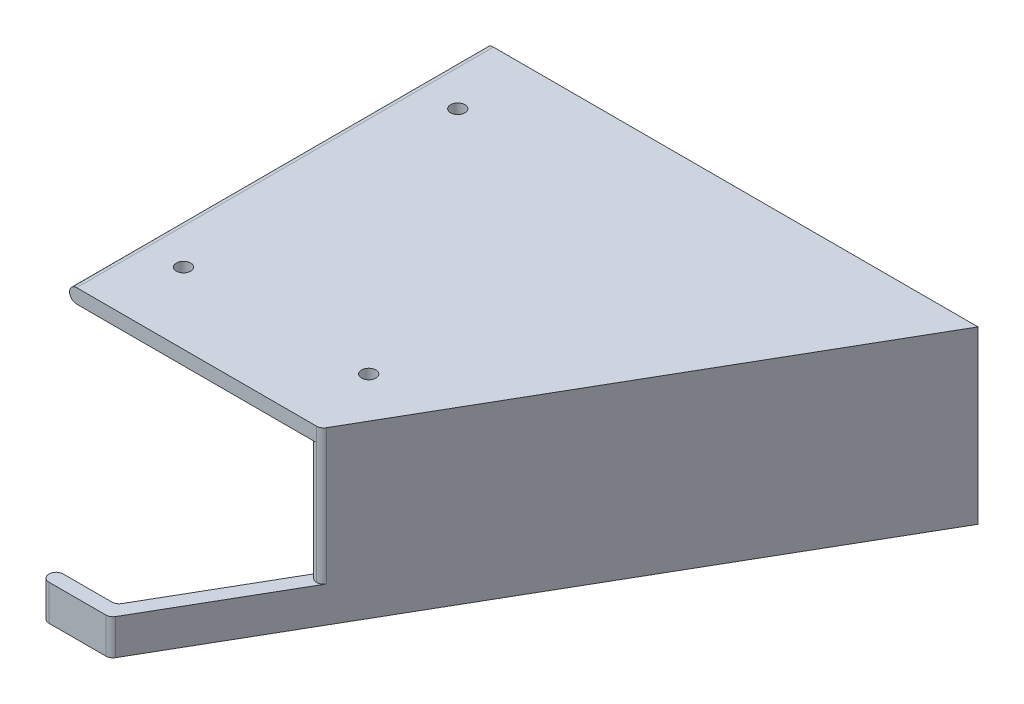
ISO-10303-21;
HEADER;
FILE_DESCRIPTION(('STEP AP214'),'2;1');
FILE_NAME('part.step','',(''),(''),'','','');
FILE_SCHEMA(('AUTOMOTIVE_DESIGN { 1 0 10303 214 1 1 1 1 }'));
ENDSEC;
DATA;
#1=APPLICATION_CONTEXT('core data for automotive mechanical design processes');
#2=APPLICATION_PROTOCOL_DEFINITION('international standard','automotive_design',2000,#1);
#3=PRODUCT_CONTEXT('',#1,'mechanical');
#4=PRODUCT('Part','Part','',(#3));
#5=PRODUCT_RELATED_PRODUCT_CATEGORY('part','',(#4));
#6=PRODUCT_DEFINITION_FORMATION('','',#4);
#7=PRODUCT_DEFINITION_CONTEXT('part definition',#1,'design');
#8=PRODUCT_DEFINITION('design','',#6,#7);
#9=PRODUCT_DEFINITION_SHAPE('','',#8);
#10=(LENGTH_UNIT() NAMED_UNIT(*) SI_UNIT(.MILLI.,.METRE.));
#11=(NAMED_UNIT(*) PLANE_ANGLE_UNIT() SI_UNIT($,.RADIAN.));
#12=(NAMED_UNIT(*) SI_UNIT($,.STERADIAN.) SOLID_ANGLE_UNIT());
#13=UNCERTAINTY_MEASURE_WITH_UNIT(LENGTH_MEASURE(1.E-05),#10,'distance_accuracy_value','');
#14=(GEOMETRIC_REPRESENTATION_CONTEXT(3) GLOBAL_UNCERTAINTY_ASSIGNED_CONTEXT((#13)) GLOBAL_UNIT_ASSIGNED_CONTEXT((#10,
#11,#12)) REPRESENTATION_CONTEXT('',''));
#15=CARTESIAN_POINT('',(0.,0.,0.));
#16=DIRECTION('',(0.,0.,1.));
#17=DIRECTION('',(1.,0.,0.));
#18=AXIS2_PLACEMENT_3D('',#15,#16,#17);
#19=CARTESIAN_POINT('',(49.2446325074975,-12.,73.4314018343474));
#20=DIRECTION('',(-0.866025403784442,0.,-0.499999999999994));
#21=DIRECTION('',(0.499999999999994,0.,-0.866025403784442));
#22=AXIS2_PLACEMENT_3D('',#19,#20,#21);
#23=PLANE('',#22);
#24=DIRECTION('',(-0.5,0.,0.866025403784439));
#25=VECTOR('',#24,1.);
#26=CARTESIAN_POINT('',(127.72466394788,10.,-62.5000000000001));
#27=LINE('',#26,#25);
#28=CARTESIAN_POINT('',(127.72466394788,10.,-62.5000000000001));
#29=VERTEX_POINT('',#28);
#30=CARTESIAN_POINT('',(94.8156986040718,10.,-5.50000000000008));
#31=VERTEX_POINT('',#30);
#32=EDGE_CURVE('E155',#29,#31,#27,.T.);
#33=ORIENTED_EDGE('',*,*,#32,.F.);
#34=DIRECTION('',(0.,1.,0.));
#35=VECTOR('',#34,1.);
#36=CARTESIAN_POINT('',(127.72466394788,-12.,-62.5000000000001));
#37=LINE('',#36,#35);
#38=CARTESIAN_POINT('',(127.72466394788,-12.,-62.5000000000001));
#39=VERTEX_POINT('',#38);
#40=EDGE_CURVE('E165',#39,#29,#37,.T.);
#41=ORIENTED_EDGE('',*,*,#40,.F.);
#42=DIRECTION('',(0.499999999999994,0.,-0.866025403784442));
#43=VECTOR('',#42,1.);
#44=CARTESIAN_POINT('',(49.2446325074975,-12.,73.4314018343474));
#45=LINE('',#44,#43);
#46=CARTESIAN_POINT('',(84.5677313259561,-12.,12.25));
#47=VERTEX_POINT('',#46);
#48=EDGE_CURVE('E174',#47,#39,#45,.T.);
#49=ORIENTED_EDGE('',*,*,#48,.F.);
#50=DIRECTION('',(0.,1.,0.));
#51=VECTOR('',#50,1.);
#52=CARTESIAN_POINT('',(84.5677313259561,-12.,12.2499999999999));
#53=LINE('',#52,#51);
#54=CARTESIAN_POINT('',(84.5677313259561,-7.,12.25));
#55=VERTEX_POINT('',#54);
#56=EDGE_CURVE('E241',#55,#47,#53,.F.);
#57=ORIENTED_EDGE('',*,*,#56,.F.);
#58=DIRECTION('',(0.499999999999994,0.,-0.866025403784442));
#59=VECTOR('',#58,1.);
#60=CARTESIAN_POINT('',(49.2446325074975,-7.,73.4314018343474));
#61=LINE('',#60,#59);
#62=CARTESIAN_POINT('',(94.8156986040718,-7.,-5.50000000000007));
#63=VERTEX_POINT('',#62);
#64=EDGE_CURVE('E198',#55,#63,#61,.T.);
#65=ORIENTED_EDGE('',*,*,#64,.T.);
#66=DIRECTION('',(0.,-1.,0.));
#67=VECTOR('',#66,1.);
#68=CARTESIAN_POINT('',(94.8156986040718,-12.,-5.50000000000007));
#69=LINE('',#68,#67);
#70=EDGE_CURVE('E178',#31,#63,#69,.T.);
#71=ORIENTED_EDGE('',*,*,#70,.F.);
#72=EDGE_LOOP('',(#33,#41,#49,#57,#65,#71));
#73=FACE_BOUND('',#72,.T.);
#74=ADVANCED_FACE('F45',(#73),#23,.T.);
#75=CARTESIAN_POINT('',(50.9766833150663,-12.,74.4314018343474));
#76=DIRECTION('',(-0.866025403784442,0.,-0.499999999999995));
#77=DIRECTION('',(0.499999999999995,0.,-0.866025403784442));
#78=AXIS2_PLACEMENT_3D('',#75,#76,#77);
#79=PLANE('',#78);
#80=DIRECTION('',(0.499999999999995,0.,-0.866025403784442));
#81=VECTOR('',#80,1.);
#82=CARTESIAN_POINT('',(50.9766833150663,-7.,74.4314018343474));
#83=LINE('',#82,#81);
#84=CARTESIAN_POINT('',(85.7224318643353,-7.,14.2499999999999));
#85=VERTEX_POINT('',#84);
#86=CARTESIAN_POINT('',(96.5477494116406,-7.,-4.50000000000009));
#87=VERTEX_POINT('',#86);
#88=EDGE_CURVE('E201',#85,#87,#83,.T.);
#89=ORIENTED_EDGE('',*,*,#88,.F.);
#90=DIRECTION('',(0.,1.,0.));
#91=VECTOR('',#90,1.);
#92=CARTESIAN_POINT('',(85.7224318643353,-12.,14.2499999999999));
#93=LINE('',#92,#91);
#94=CARTESIAN_POINT('',(85.7224318643353,-12.,14.2499999999999));
#95=VERTEX_POINT('',#94);
#96=EDGE_CURVE('E208',#95,#85,#93,.T.);
#97=ORIENTED_EDGE('',*,*,#96,.F.);
#98=DIRECTION('',(0.499999999999995,0.,-0.866025403784442));
#99=VECTOR('',#98,1.);
#100=CARTESIAN_POINT('',(50.9766833150663,-12.,74.4314018343474));
#101=LINE('',#100,#99);
#102=CARTESIAN_POINT('',(130.034065024638,-12.,-62.5000000000001));
#103=VERTEX_POINT('',#102);
#104=EDGE_CURVE('E195',#95,#103,#101,.T.);
#105=ORIENTED_EDGE('',*,*,#104,.T.);
#106=DIRECTION('',(0.,1.,0.));
#107=VECTOR('',#106,1.);
#108=CARTESIAN_POINT('',(130.034065024638,-12.,-62.5000000000001));
#109=LINE('',#108,#107);
#110=CARTESIAN_POINT('',(130.034065024638,12.,-62.5000000000001));
#111=VERTEX_POINT('',#110);
#112=EDGE_CURVE('E173',#103,#111,#109,.T.);
#113=ORIENTED_EDGE('',*,*,#112,.T.);
#114=DIRECTION('',(-0.499999999999995,0.,0.866025403784442));
#115=VECTOR('',#114,1.);
#116=CARTESIAN_POINT('',(50.9766833150663,12.,74.4314018343474));
#117=LINE('',#116,#115);
#118=CARTESIAN_POINT('',(96.5477494116406,12.,-4.50000000000008));
#119=VERTEX_POINT('',#118);
#120=EDGE_CURVE('E191',#111,#119,#117,.T.);
#121=ORIENTED_EDGE('',*,*,#120,.T.);
#122=DIRECTION('',(0.,-1.,0.));
#123=VECTOR('',#122,1.);
#124=CARTESIAN_POINT('',(96.5477494116406,12.,-4.50000000000009));
#125=LINE('',#124,#123);
#126=EDGE_CURVE('E267',#87,#119,#125,.F.);
#127=ORIENTED_EDGE('',*,*,#126,.F.);
#128=EDGE_LOOP('',(#89,#97,#105,#113,#121,#127));
#129=FACE_BOUND('',#128,.T.);
#130=ADVANCED_FACE('F313',(#129),#79,.F.);
#131=CARTESIAN_POINT('',(0.,-12.,-62.5));
#132=DIRECTION('',(0.,0.,1.));
#133=DIRECTION('',(-1.,0.,0.));
#134=AXIS2_PLACEMENT_3D('',#131,#132,#133);
#135=PLANE('',#134);
#136=CARTESIAN_POINT('',(62.,11.,-62.5000000000001));
#137=DIRECTION('',(0.,0.,-1.));
#138=DIRECTION('',(-1.,0.,0.));
#139=AXIS2_PLACEMENT_3D('',#136,#137,#138);
#140=CIRCLE('',#139,1.);
#141=CARTESIAN_POINT('',(62.,12.,-62.5000000000001));
#142=VERTEX_POINT('',#141);
#143=CARTESIAN_POINT('',(61.,11.,-62.5000000000001));
#144=VERTEX_POINT('',#143);
#145=EDGE_CURVE('E249',#142,#144,#140,.F.);
#146=ORIENTED_EDGE('',*,*,#145,.F.);
#147=DIRECTION('',(1.,0.,0.));
#148=VECTOR('',#147,1.);
#149=CARTESIAN_POINT('',(0.,12.,-62.5));
#150=LINE('',#149,#148);
#151=EDGE_CURVE('E189',#142,#111,#150,.T.);
#152=ORIENTED_EDGE('',*,*,#151,.T.);
#153=ORIENTED_EDGE('',*,*,#112,.F.);
#154=DIRECTION('',(-1.,0.,0.));
#155=VECTOR('',#154,1.);
#156=CARTESIAN_POINT('',(0.,-12.,-62.5));
#157=LINE('',#156,#155);
#158=EDGE_CURVE('E169',#103,#39,#157,.T.);
#159=ORIENTED_EDGE('',*,*,#158,.T.);
#160=ORIENTED_EDGE('',*,*,#40,.T.);
#161=DIRECTION('',(1.,0.,0.));
#162=VECTOR('',#161,1.);
#163=CARTESIAN_POINT('',(61.,10.,-62.5000000000001));
#164=LINE('',#163,#162);
#165=CARTESIAN_POINT('',(62.,10.,-62.5000000000001));
#166=VERTEX_POINT('',#165);
#167=EDGE_CURVE('E150',#166,#29,#164,.T.);
#168=ORIENTED_EDGE('',*,*,#167,.F.);
#169=CARTESIAN_POINT('',(62.,11.,-62.5000000000001));
#170=DIRECTION('',(0.,0.,-1.));
#171=DIRECTION('',(-1.,0.,0.));
#172=AXIS2_PLACEMENT_3D('',#169,#170,#171);
#173=CIRCLE('',#172,1.);
#174=EDGE_CURVE('E252',#144,#166,#173,.F.);
#175=ORIENTED_EDGE('',*,*,#174,.F.);
#176=EDGE_LOOP('',(#146,#152,#153,#159,#160,#168,#175));
#177=FACE_BOUND('',#176,.T.);
#178=ADVANCED_FACE('F167',(#177),#135,.F.);
#179=CARTESIAN_POINT('',(0.,-7.,45.));
#180=DIRECTION('',(0.,-1.,0.));
#181=DIRECTION('',(0.,0.,1.));
#182=AXIS2_PLACEMENT_3D('',#179,#180,#181);
#183=PLANE('',#182);
#184=ORIENTED_EDGE('',*,*,#64,.F.);
#185=CARTESIAN_POINT('',(83.7017059221717,-7.,11.75));
#186=DIRECTION('',(0.,1.,0.));
#187=DIRECTION('',(0.,0.,1.));
#188=AXIS2_PLACEMENT_3D('',#185,#186,#187);
#189=CIRCLE('',#188,1.);
#190=CARTESIAN_POINT('',(83.7017059221717,-7.,12.75));
#191=VERTEX_POINT('',#190);
#192=EDGE_CURVE('E244',#191,#55,#189,.T.);
#193=ORIENTED_EDGE('',*,*,#192,.F.);
#194=DIRECTION('',(-1.,0.,0.));
#195=VECTOR('',#194,1.);
#196=CARTESIAN_POINT('',(84.8564064605509,-7.,12.75));
#197=LINE('',#196,#195);
#198=CARTESIAN_POINT('',(76.8564064605509,-7.,12.75));
#199=VERTEX_POINT('',#198);
#200=EDGE_CURVE('E216',#191,#199,#197,.T.);
#201=ORIENTED_EDGE('',*,*,#200,.T.);
#202=CARTESIAN_POINT('',(76.8564064605509,-7.,13.75));
#203=DIRECTION('',(0.,-1.,0.));
#204=DIRECTION('',(0.,0.,-1.));
#205=AXIS2_PLACEMENT_3D('',#202,#203,#204);
#206=CIRCLE('',#205,0.999999999999985);
#207=CARTESIAN_POINT('',(76.8564064605509,-7.,14.7499999999999));
#208=VERTEX_POINT('',#207);
#209=EDGE_CURVE('E231',#208,#199,#206,.T.);
#210=ORIENTED_EDGE('',*,*,#209,.F.);
#211=DIRECTION('',(-1.,0.,0.));
#212=VECTOR('',#211,1.);
#213=CARTESIAN_POINT('',(84.8564064605509,-7.,14.7499999999999));
#214=LINE('',#213,#212);
#215=CARTESIAN_POINT('',(84.8564064605509,-7.,14.7499999999999));
#216=VERTEX_POINT('',#215);
#217=EDGE_CURVE('E228',#216,#208,#214,.T.);
#218=ORIENTED_EDGE('',*,*,#217,.F.);
#219=CARTESIAN_POINT('',(84.8564064605509,-7.,13.75));
#220=DIRECTION('',(0.,-1.,0.));
#221=DIRECTION('',(0.,0.,-1.));
#222=AXIS2_PLACEMENT_3D('',#219,#220,#221);
#223=CIRCLE('',#222,0.999999999999987);
#224=EDGE_CURVE('E194',#85,#216,#223,.T.);
#225=ORIENTED_EDGE('',*,*,#224,.F.);
#226=ORIENTED_EDGE('',*,*,#88,.T.);
#227=CARTESIAN_POINT('',(95.6817240078562,-7.,-5.00000000000009));
#228=DIRECTION('',(0.,1.,0.));
#229=DIRECTION('',(0.,0.,1.));
#230=AXIS2_PLACEMENT_3D('',#227,#228,#229);
#231=CIRCLE('',#230,1.);
#232=CARTESIAN_POINT('',(95.6817240078562,-7.,-4.00000000000009));
#233=VERTEX_POINT('',#232);
#234=EDGE_CURVE('E271',#233,#87,#231,.T.);
#235=ORIENTED_EDGE('',*,*,#234,.F.);
#236=CARTESIAN_POINT('',(95.6817240078562,-7.,-5.00000000000009));
#237=DIRECTION('',(0.,1.,0.));
#238=DIRECTION('',(0.,0.,1.));
#239=AXIS2_PLACEMENT_3D('',#236,#237,#238);
#240=CIRCLE('',#239,1.);
#241=EDGE_CURVE('E54',#63,#233,#240,.T.);
#242=ORIENTED_EDGE('',*,*,#241,.F.);
#243=EDGE_LOOP('',(#184,#193,#201,#210,#218,#225,#226,#235,#242));
#244=FACE_BOUND('',#243,.T.);
#245=ADVANCED_FACE('F324',(#244),#183,.F.);
#246=CARTESIAN_POINT('',(0.,-12.,45.));
#247=DIRECTION('',(0.,-1.,0.));
#248=DIRECTION('',(0.,0.,1.));
#249=AXIS2_PLACEMENT_3D('',#246,#247,#248);
#250=PLANE('',#249);
#251=ORIENTED_EDGE('',*,*,#48,.T.);
#252=ORIENTED_EDGE('',*,*,#158,.F.);
#253=ORIENTED_EDGE('',*,*,#104,.F.);
#254=CARTESIAN_POINT('',(84.8564064605509,-12.,13.75));
#255=DIRECTION('',(0.,-1.,0.));
#256=DIRECTION('',(0.,0.,-1.));
#257=AXIS2_PLACEMENT_3D('',#254,#255,#256);
#258=CIRCLE('',#257,0.999999999999987);
#259=CARTESIAN_POINT('',(84.8564064605509,-12.,14.7499999999999));
#260=VERTEX_POINT('',#259);
#261=EDGE_CURVE('E212',#95,#260,#258,.T.);
#262=ORIENTED_EDGE('',*,*,#261,.T.);
#263=DIRECTION('',(-1.,0.,0.));
#264=VECTOR('',#263,1.);
#265=CARTESIAN_POINT('',(84.8564064605509,-12.,14.7499999999999));
#266=LINE('',#265,#264);
#267=CARTESIAN_POINT('',(76.8564064605509,-12.,14.7499999999999));
#268=VERTEX_POINT('',#267);
#269=EDGE_CURVE('E215',#260,#268,#266,.T.);
#270=ORIENTED_EDGE('',*,*,#269,.T.);
#271=CARTESIAN_POINT('',(76.8564064605509,-12.,13.75));
#272=DIRECTION('',(0.,-1.,0.));
#273=DIRECTION('',(0.,0.,-1.));
#274=AXIS2_PLACEMENT_3D('',#271,#272,#273);
#275=CIRCLE('',#274,0.999999999999985);
#276=CARTESIAN_POINT('',(76.8564064605509,-12.,12.75));
#277=VERTEX_POINT('',#276);
#278=EDGE_CURVE('E219',#268,#277,#275,.T.);
#279=ORIENTED_EDGE('',*,*,#278,.T.);
#280=DIRECTION('',(-1.,0.,0.));
#281=VECTOR('',#280,1.);
#282=CARTESIAN_POINT('',(84.8564064605509,-12.,12.75));
#283=LINE('',#282,#281);
#284=CARTESIAN_POINT('',(83.7017059221717,-12.,12.75));
#285=VERTEX_POINT('',#284);
#286=EDGE_CURVE('E222',#285,#277,#283,.T.);
#287=ORIENTED_EDGE('',*,*,#286,.F.);
#288=CARTESIAN_POINT('',(83.7017059221717,-12.,11.75));
#289=DIRECTION('',(0.,1.,0.));
#290=DIRECTION('',(0.,0.,1.));
#291=AXIS2_PLACEMENT_3D('',#288,#289,#290);
#292=CIRCLE('',#291,1.);
#293=EDGE_CURVE('E246',#47,#285,#292,.F.);
#294=ORIENTED_EDGE('',*,*,#293,.F.);
#295=EDGE_LOOP('',(#251,#252,#253,#262,#270,#279,#287,#294));
#296=FACE_BOUND('',#295,.T.);
#297=ADVANCED_FACE('F332',(#296),#250,.T.);
#298=CARTESIAN_POINT('',(84.8564064605509,-12.,12.75));
#299=DIRECTION('',(0.,0.,1.));
#300=DIRECTION('',(-1.,0.,0.));
#301=AXIS2_PLACEMENT_3D('',#298,#299,#300);
#302=PLANE('',#301);
#303=ORIENTED_EDGE('',*,*,#286,.T.);
#304=DIRECTION('',(0.,1.,0.));
#305=VECTOR('',#304,1.);
#306=CARTESIAN_POINT('',(76.8564064605509,-12.,12.75));
#307=LINE('',#306,#305);
#308=EDGE_CURVE('E204',#277,#199,#307,.T.);
#309=ORIENTED_EDGE('',*,*,#308,.T.);
#310=ORIENTED_EDGE('',*,*,#200,.F.);
#311=DIRECTION('',(0.,1.,0.));
#312=VECTOR('',#311,1.);
#313=CARTESIAN_POINT('',(83.7017059221717,-12.,12.75));
#314=LINE('',#313,#312);
#315=EDGE_CURVE('E211',#285,#191,#314,.T.);
#316=ORIENTED_EDGE('',*,*,#315,.F.);
#317=EDGE_LOOP('',(#303,#309,#310,#316));
#318=FACE_BOUND('',#317,.T.);
#319=ADVANCED_FACE('F328',(#318),#302,.F.);
#320=CARTESIAN_POINT('',(76.8564064605509,-12.,13.75));
#321=DIRECTION('',(0.,1.,0.));
#322=DIRECTION('',(0.,0.,-1.));
#323=AXIS2_PLACEMENT_3D('',#320,#321,#322);
#324=CYLINDRICAL_SURFACE('',#323,0.999999999999985);
#325=ORIENTED_EDGE('',*,*,#209,.T.);
#326=ORIENTED_EDGE('',*,*,#308,.F.);
#327=ORIENTED_EDGE('',*,*,#278,.F.);
#328=DIRECTION('',(0.,1.,0.));
#329=VECTOR('',#328,1.);
#330=CARTESIAN_POINT('',(76.8564064605509,-12.,14.7499999999999));
#331=LINE('',#330,#329);
#332=EDGE_CURVE('E237',#268,#208,#331,.T.);
#333=ORIENTED_EDGE('',*,*,#332,.T.);
#334=EDGE_LOOP('',(#325,#326,#327,#333));
#335=FACE_BOUND('',#334,.T.);
#336=ADVANCED_FACE('F331',(#335),#324,.T.);
#337=CARTESIAN_POINT('',(84.8564064605509,-12.,14.7499999999999));
#338=DIRECTION('',(0.,0.,1.));
#339=DIRECTION('',(-1.,0.,0.));
#340=AXIS2_PLACEMENT_3D('',#337,#338,#339);
#341=PLANE('',#340);
#342=ORIENTED_EDGE('',*,*,#217,.T.);
#343=ORIENTED_EDGE('',*,*,#332,.F.);
#344=ORIENTED_EDGE('',*,*,#269,.F.);
#345=DIRECTION('',(0.,1.,0.));
#346=VECTOR('',#345,1.);
#347=CARTESIAN_POINT('',(84.8564064605509,-12.,14.7499999999999));
#348=LINE('',#347,#346);
#349=EDGE_CURVE('E225',#260,#216,#348,.T.);
#350=ORIENTED_EDGE('',*,*,#349,.T.);
#351=EDGE_LOOP('',(#342,#343,#344,#350));
#352=FACE_BOUND('',#351,.T.);
#353=ADVANCED_FACE('F336',(#352),#341,.T.);
#354=CARTESIAN_POINT('',(84.8564064605509,-12.,13.75));
#355=DIRECTION('',(0.,1.,0.));
#356=DIRECTION('',(0.,0.,-1.));
#357=AXIS2_PLACEMENT_3D('',#354,#355,#356);
#358=CYLINDRICAL_SURFACE('',#357,0.999999999999987);
#359=ORIENTED_EDGE('',*,*,#96,.T.);
#360=ORIENTED_EDGE('',*,*,#224,.T.);
#361=ORIENTED_EDGE('',*,*,#349,.F.);
#362=ORIENTED_EDGE('',*,*,#261,.F.);
#363=EDGE_LOOP('',(#359,#360,#361,#362));
#364=FACE_BOUND('',#363,.T.);
#365=ADVANCED_FACE('F340',(#364),#358,.T.);
#366=CARTESIAN_POINT('',(83.7017059221717,-12.,11.75));
#367=DIRECTION('',(0.,1.,0.));
#368=DIRECTION('',(0.,0.,-1.));
#369=AXIS2_PLACEMENT_3D('',#366,#367,#368);
#370=CYLINDRICAL_SURFACE('',#369,1.);
#371=ORIENTED_EDGE('',*,*,#293,.T.);
#372=ORIENTED_EDGE('',*,*,#315,.T.);
#373=ORIENTED_EDGE('',*,*,#192,.T.);
#374=ORIENTED_EDGE('',*,*,#56,.T.);
#375=EDGE_LOOP('',(#371,#372,#373,#374));
#376=FACE_BOUND('',#375,.T.);
#377=ADVANCED_FACE('F344',(#376),#370,.F.);
#378=CARTESIAN_POINT('',(0.,12.,-4.00000000000003));
#379=DIRECTION('',(0.,0.,1.));
#380=DIRECTION('',(-1.,0.,0.));
#381=AXIS2_PLACEMENT_3D('',#378,#379,#380);
#382=PLANE('',#381);
#383=DIRECTION('',(-1.,0.,0.));
#384=VECTOR('',#383,1.);
#385=CARTESIAN_POINT('',(93.9496732002874,10.,-4.00000000000007));
#386=LINE('',#385,#384);
#387=CARTESIAN_POINT('',(95.6817240078562,10.,-4.00000000000008));
#388=VERTEX_POINT('',#387);
#389=CARTESIAN_POINT('',(62.,10.,-4.00000000000007));
#390=VERTEX_POINT('',#389);
#391=EDGE_CURVE('E162',#388,#390,#386,.T.);
#392=ORIENTED_EDGE('',*,*,#391,.F.);
#393=DIRECTION('',(0.,-1.,0.));
#394=VECTOR('',#393,1.);
#395=CARTESIAN_POINT('',(95.6817240078562,-7.,-4.00000000000009));
#396=LINE('',#395,#394);
#397=CARTESIAN_POINT('',(95.6817240078562,12.,-4.00000000000009));
#398=VERTEX_POINT('',#397);
#399=EDGE_CURVE('E255',#398,#388,#396,.T.);
#400=ORIENTED_EDGE('',*,*,#399,.F.);
#401=DIRECTION('',(1.,0.,0.));
#402=VECTOR('',#401,1.);
#403=CARTESIAN_POINT('',(0.,12.,-4.00000000000003));
#404=LINE('',#403,#402);
#405=CARTESIAN_POINT('',(62.,12.,-4.00000000000007));
#406=VERTEX_POINT('',#405);
#407=EDGE_CURVE('E161',#406,#398,#404,.T.);
#408=ORIENTED_EDGE('',*,*,#407,.F.);
#409=CARTESIAN_POINT('',(62.,11.,-4.00000000000007));
#410=DIRECTION('',(0.,0.,-1.));
#411=DIRECTION('',(-1.,0.,0.));
#412=AXIS2_PLACEMENT_3D('',#409,#410,#411);
#413=CIRCLE('',#412,1.);
#414=CARTESIAN_POINT('',(61.,11.,-4.00000000000007));
#415=VERTEX_POINT('',#414);
#416=EDGE_CURVE('E257',#415,#406,#413,.T.);
#417=ORIENTED_EDGE('',*,*,#416,.F.);
#418=CARTESIAN_POINT('',(62.,11.,-4.00000000000007));
#419=DIRECTION('',(0.,0.,-1.));
#420=DIRECTION('',(-1.,0.,0.));
#421=AXIS2_PLACEMENT_3D('',#418,#419,#420);
#422=CIRCLE('',#421,1.);
#423=EDGE_CURVE('E260',#390,#415,#422,.T.);
#424=ORIENTED_EDGE('',*,*,#423,.F.);
#425=EDGE_LOOP('',(#392,#400,#408,#417,#424));
#426=FACE_BOUND('',#425,.T.);
#427=ADVANCED_FACE('F348',(#426),#382,.T.);
#428=CARTESIAN_POINT('',(0.,12.,45.));
#429=DIRECTION('',(0.,1.,0.));
#430=DIRECTION('',(0.,0.,-1.));
#431=AXIS2_PLACEMENT_3D('',#428,#429,#430);
#432=PLANE('',#431);
#433=CARTESIAN_POINT('',(93.,12.,-14.0000000000001));
#434=DIRECTION('',(0.,-1.,0.));
#435=DIRECTION('',(0.,0.,-1.));
#436=AXIS2_PLACEMENT_3D('',#433,#434,#435);
#437=CIRCLE('',#436,0.999999999999998);
#438=CARTESIAN_POINT('',(93.,12.,-15.0000000000001));
#439=VERTEX_POINT('',#438);
#440=EDGE_CURVE('E278',#439,#439,#437,.T.);
#441=ORIENTED_EDGE('',*,*,#440,.T.);
#442=EDGE_LOOP('',(#441));
#443=FACE_BOUND('',#442,.T.);
#444=ORIENTED_EDGE('',*,*,#407,.T.);
#445=CARTESIAN_POINT('',(95.6817240078562,12.,-5.00000000000009));
#446=DIRECTION('',(0.,-1.,0.));
#447=DIRECTION('',(0.,0.,-1.));
#448=AXIS2_PLACEMENT_3D('',#445,#446,#447);
#449=CIRCLE('',#448,1.);
#450=EDGE_CURVE('E263',#119,#398,#449,.T.);
#451=ORIENTED_EDGE('',*,*,#450,.F.);
#452=ORIENTED_EDGE('',*,*,#120,.F.);
#453=ORIENTED_EDGE('',*,*,#151,.F.);
#454=DIRECTION('',(0.,0.,-1.));
#455=VECTOR('',#454,1.);
#456=CARTESIAN_POINT('',(62.,12.,44.9999999999999));
#457=LINE('',#456,#455);
#458=EDGE_CURVE('E265',#406,#142,#457,.T.);
#459=ORIENTED_EDGE('',*,*,#458,.F.);
#460=EDGE_LOOP('',(#444,#451,#452,#453,#459));
#461=FACE_BOUND('',#460,.T.);
#462=CARTESIAN_POINT('',(67.,12.,-52.5000000000001));
#463=DIRECTION('',(0.,-1.,0.));
#464=DIRECTION('',(0.,0.,-1.));
#465=AXIS2_PLACEMENT_3D('',#462,#463,#464);
#466=CIRCLE('',#465,0.999999999999998);
#467=CARTESIAN_POINT('',(67.,12.,-53.5000000000001));
#468=VERTEX_POINT('',#467);
#469=EDGE_CURVE('E275',#468,#468,#466,.T.);
#470=ORIENTED_EDGE('',*,*,#469,.T.);
#471=EDGE_LOOP('',(#470));
#472=FACE_BOUND('',#471,.T.);
#473=CARTESIAN_POINT('',(67.,12.,-14.));
#474=DIRECTION('',(0.,-1.,0.));
#475=DIRECTION('',(0.,0.,-1.));
#476=AXIS2_PLACEMENT_3D('',#473,#474,#475);
#477=CIRCLE('',#476,0.999999999999998);
#478=CARTESIAN_POINT('',(67.,12.,-15.));
#479=VERTEX_POINT('',#478);
#480=EDGE_CURVE('E183',#479,#479,#477,.T.);
#481=ORIENTED_EDGE('',*,*,#480,.T.);
#482=EDGE_LOOP('',(#481));
#483=FACE_BOUND('',#482,.T.);
#484=ADVANCED_FACE('F292',(#443,#461,#472,#483),#432,.T.);
#485=CARTESIAN_POINT('',(0.,10.,45.));
#486=DIRECTION('',(0.,1.,0.));
#487=DIRECTION('',(0.,0.,-1.));
#488=AXIS2_PLACEMENT_3D('',#485,#486,#487);
#489=PLANE('',#488);
#490=CARTESIAN_POINT('',(93.,10.,-14.0000000000001));
#491=DIRECTION('',(0.,-1.,0.));
#492=DIRECTION('',(0.,0.,-1.));
#493=AXIS2_PLACEMENT_3D('',#490,#491,#492);
#494=CIRCLE('',#493,0.999999999999998);
#495=CARTESIAN_POINT('',(93.,10.,-15.0000000000001));
#496=VERTEX_POINT('',#495);
#497=EDGE_CURVE('E49',#496,#496,#494,.T.);
#498=ORIENTED_EDGE('',*,*,#497,.F.);
#499=EDGE_LOOP('',(#498));
#500=FACE_BOUND('',#499,.T.);
#501=CARTESIAN_POINT('',(67.,10.,-52.5000000000001));
#502=DIRECTION('',(0.,-1.,0.));
#503=DIRECTION('',(0.,0.,-1.));
#504=AXIS2_PLACEMENT_3D('',#501,#502,#503);
#505=CIRCLE('',#504,0.999999999999998);
#506=CARTESIAN_POINT('',(67.,10.,-53.5000000000001));
#507=VERTEX_POINT('',#506);
#508=EDGE_CURVE('E286',#507,#507,#505,.T.);
#509=ORIENTED_EDGE('',*,*,#508,.F.);
#510=EDGE_LOOP('',(#509));
#511=FACE_BOUND('',#510,.T.);
#512=CARTESIAN_POINT('',(67.,10.,-14.));
#513=DIRECTION('',(0.,-1.,0.));
#514=DIRECTION('',(0.,0.,-1.));
#515=AXIS2_PLACEMENT_3D('',#512,#513,#514);
#516=CIRCLE('',#515,0.999999999999998);
#517=CARTESIAN_POINT('',(67.,10.,-15.));
#518=VERTEX_POINT('',#517);
#519=EDGE_CURVE('E179',#518,#518,#516,.T.);
#520=ORIENTED_EDGE('',*,*,#519,.F.);
#521=EDGE_LOOP('',(#520));
#522=FACE_BOUND('',#521,.T.);
#523=ORIENTED_EDGE('',*,*,#167,.T.);
#524=ORIENTED_EDGE('',*,*,#32,.T.);
#525=CARTESIAN_POINT('',(95.6817240078562,10.,-5.00000000000009));
#526=DIRECTION('',(0.,-1.,0.));
#527=DIRECTION('',(0.,0.,-1.));
#528=AXIS2_PLACEMENT_3D('',#525,#526,#527);
#529=CIRCLE('',#528,1.);
#530=EDGE_CURVE('E11',#388,#31,#529,.T.);
#531=ORIENTED_EDGE('',*,*,#530,.F.);
#532=ORIENTED_EDGE('',*,*,#391,.T.);
#533=DIRECTION('',(0.,0.,-1.));
#534=VECTOR('',#533,1.);
#535=CARTESIAN_POINT('',(62.,10.,-4.00000000000007));
#536=LINE('',#535,#534);
#537=EDGE_CURVE('E157',#166,#390,#536,.F.);
#538=ORIENTED_EDGE('',*,*,#537,.F.);
#539=EDGE_LOOP('',(#523,#524,#531,#532,#538));
#540=FACE_BOUND('',#539,.T.);
#541=ADVANCED_FACE('F152',(#500,#511,#522,#540),#489,.F.);
#542=CARTESIAN_POINT('',(67.,10.,-14.));
#543=DIRECTION('',(0.,1.,0.));
#544=DIRECTION('',(0.,0.,-1.));
#545=AXIS2_PLACEMENT_3D('',#542,#543,#544);
#546=CYLINDRICAL_SURFACE('',#545,0.999999999999998);
#547=ORIENTED_EDGE('',*,*,#519,.T.);
#548=EDGE_LOOP('',(#547));
#549=FACE_BOUND('',#548,.T.);
#550=ORIENTED_EDGE('',*,*,#480,.F.);
#551=EDGE_LOOP('',(#550));
#552=FACE_BOUND('',#551,.T.);
#553=ADVANCED_FACE('F298',(#549,#552),#546,.F.);
#554=CARTESIAN_POINT('',(67.,10.,-52.5000000000001));
#555=DIRECTION('',(0.,1.,0.));
#556=DIRECTION('',(0.,0.,-1.));
#557=AXIS2_PLACEMENT_3D('',#554,#555,#556);
#558=CYLINDRICAL_SURFACE('',#557,0.999999999999998);
#559=ORIENTED_EDGE('',*,*,#508,.T.);
#560=EDGE_LOOP('',(#559));
#561=FACE_BOUND('',#560,.T.);
#562=ORIENTED_EDGE('',*,*,#469,.F.);
#563=EDGE_LOOP('',(#562));
#564=FACE_BOUND('',#563,.T.);
#565=ADVANCED_FACE('F295',(#561,#564),#558,.F.);
#566=CARTESIAN_POINT('',(62.,11.,44.9999999999999));
#567=DIRECTION('',(0.,0.,-1.));
#568=DIRECTION('',(1.,0.,0.));
#569=AXIS2_PLACEMENT_3D('',#566,#567,#568);
#570=CYLINDRICAL_SURFACE('',#569,1.);
#571=ORIENTED_EDGE('',*,*,#458,.T.);
#572=ORIENTED_EDGE('',*,*,#145,.T.);
#573=DIRECTION('',(0.,0.,-1.));
#574=VECTOR('',#573,1.);
#575=CARTESIAN_POINT('',(61.,11.,-4.00000000000007));
#576=LINE('',#575,#574);
#577=EDGE_CURVE('E274',#144,#415,#576,.F.);
#578=ORIENTED_EDGE('',*,*,#577,.T.);
#579=ORIENTED_EDGE('',*,*,#416,.T.);
#580=EDGE_LOOP('',(#571,#572,#578,#579));
#581=FACE_BOUND('',#580,.T.);
#582=ADVANCED_FACE('F297',(#581),#570,.T.);
#583=CARTESIAN_POINT('',(62.,11.,-4.00000000000007));
#584=DIRECTION('',(0.,0.,1.));
#585=DIRECTION('',(-1.,0.,0.));
#586=AXIS2_PLACEMENT_3D('',#583,#584,#585);
#587=CYLINDRICAL_SURFACE('',#586,1.);
#588=ORIENTED_EDGE('',*,*,#423,.T.);
#589=ORIENTED_EDGE('',*,*,#577,.F.);
#590=ORIENTED_EDGE('',*,*,#174,.T.);
#591=ORIENTED_EDGE('',*,*,#537,.T.);
#592=EDGE_LOOP('',(#588,#589,#590,#591));
#593=FACE_BOUND('',#592,.T.);
#594=ADVANCED_FACE('F306',(#593),#587,.T.);
#595=CARTESIAN_POINT('',(95.6817240078562,-12.,-5.00000000000009));
#596=DIRECTION('',(0.,-1.,0.));
#597=DIRECTION('',(0.,0.,1.));
#598=AXIS2_PLACEMENT_3D('',#595,#596,#597);
#599=CYLINDRICAL_SURFACE('',#598,1.);
#600=ORIENTED_EDGE('',*,*,#70,.T.);
#601=ORIENTED_EDGE('',*,*,#241,.T.);
#602=DIRECTION('',(0.,-1.,0.));
#603=VECTOR('',#602,1.);
#604=CARTESIAN_POINT('',(95.6817240078562,12.,-4.00000000000009));
#605=LINE('',#604,#603);
#606=EDGE_CURVE('E62',#233,#388,#605,.F.);
#607=ORIENTED_EDGE('',*,*,#606,.T.);
#608=ORIENTED_EDGE('',*,*,#530,.T.);
#609=EDGE_LOOP('',(#600,#601,#607,#608));
#610=FACE_BOUND('',#609,.T.);
#611=ADVANCED_FACE('F47',(#610),#599,.T.);
#612=CARTESIAN_POINT('',(95.6817240078562,12.,-5.00000000000009));
#613=DIRECTION('',(0.,1.,0.));
#614=DIRECTION('',(0.,0.,-1.));
#615=AXIS2_PLACEMENT_3D('',#612,#613,#614);
#616=CYLINDRICAL_SURFACE('',#615,1.);
#617=ORIENTED_EDGE('',*,*,#450,.T.);
#618=ORIENTED_EDGE('',*,*,#399,.T.);
#619=ORIENTED_EDGE('',*,*,#606,.F.);
#620=ORIENTED_EDGE('',*,*,#234,.T.);
#621=ORIENTED_EDGE('',*,*,#126,.T.);
#622=EDGE_LOOP('',(#617,#618,#619,#620,#621));
#623=FACE_BOUND('',#622,.T.);
#624=ADVANCED_FACE('F352',(#623),#616,.T.);
#625=CARTESIAN_POINT('',(93.,2.,-14.0000000000001));
#626=DIRECTION('',(0.,1.,0.));
#627=DIRECTION('',(0.,0.,-1.));
#628=AXIS2_PLACEMENT_3D('',#625,#626,#627);
#629=CYLINDRICAL_SURFACE('',#628,0.999999999999998);
#630=ORIENTED_EDGE('',*,*,#440,.F.);
#631=EDGE_LOOP('',(#630));
#632=FACE_BOUND('',#631,.T.);
#633=ORIENTED_EDGE('',*,*,#497,.T.);
#634=EDGE_LOOP('',(#633));
#635=FACE_BOUND('',#634,.T.);
#636=ADVANCED_FACE('F354',(#632,#635),#629,.F.);
#637=CLOSED_SHELL('',(#74,#130,#178,#245,#297,#319,#336,#353,#365,#377,#427,#484,#541,#553,#565,
#582,#594,#611,#624,#636));
#638=MANIFOLD_SOLID_BREP('B2',#637);
#639=ADVANCED_BREP_SHAPE_REPRESENTATION('',(#18,#638),#14);
#640=SHAPE_DEFINITION_REPRESENTATION(#9,#639);
ENDSEC;
END-ISO-10303-21;
